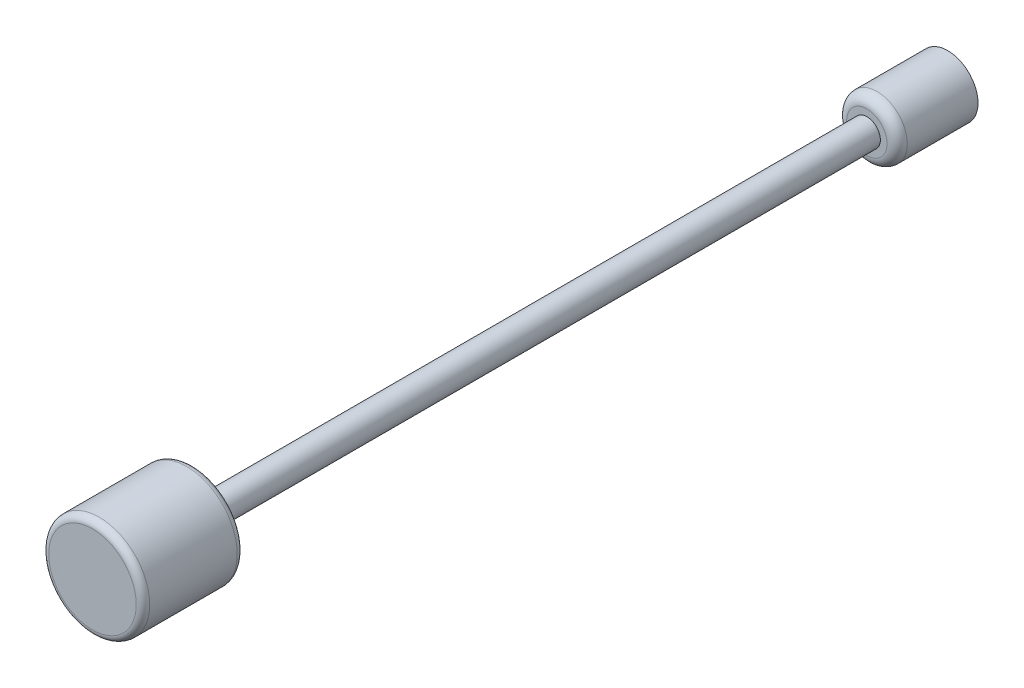
ISO-10303-21;
HEADER;
FILE_DESCRIPTION(('STEP AP214'),'2;1');
FILE_NAME('part.step','',(''),(''),'','','');
FILE_SCHEMA(('AUTOMOTIVE_DESIGN { 1 0 10303 214 1 1 1 1 }'));
ENDSEC;
DATA;
#1=APPLICATION_CONTEXT('core data for automotive mechanical design processes');
#2=APPLICATION_PROTOCOL_DEFINITION('international standard','automotive_design',2000,#1);
#3=PRODUCT_CONTEXT('',#1,'mechanical');
#4=PRODUCT('Part','Part','',(#3));
#5=PRODUCT_RELATED_PRODUCT_CATEGORY('part','',(#4));
#6=PRODUCT_DEFINITION_FORMATION('','',#4);
#7=PRODUCT_DEFINITION_CONTEXT('part definition',#1,'design');
#8=PRODUCT_DEFINITION('design','',#6,#7);
#9=PRODUCT_DEFINITION_SHAPE('','',#8);
#10=(LENGTH_UNIT() NAMED_UNIT(*) SI_UNIT(.MILLI.,.METRE.));
#11=(NAMED_UNIT(*) PLANE_ANGLE_UNIT() SI_UNIT($,.RADIAN.));
#12=(NAMED_UNIT(*) SI_UNIT($,.STERADIAN.) SOLID_ANGLE_UNIT());
#13=UNCERTAINTY_MEASURE_WITH_UNIT(LENGTH_MEASURE(1.E-05),#10,'distance_accuracy_value','');
#14=(GEOMETRIC_REPRESENTATION_CONTEXT(3) GLOBAL_UNCERTAINTY_ASSIGNED_CONTEXT((#13)) GLOBAL_UNIT_ASSIGNED_CONTEXT((#10,
#11,#12)) REPRESENTATION_CONTEXT('',''));
#15=CARTESIAN_POINT('',(0.,0.,0.));
#16=DIRECTION('',(0.,0.,1.));
#17=DIRECTION('',(1.,0.,0.));
#18=AXIS2_PLACEMENT_3D('',#15,#16,#17);
#19=CARTESIAN_POINT('',(1107.95071941482,105.911007761588,0.));
#20=DIRECTION('',(0.,0.,1.));
#21=DIRECTION('',(1.,0.,0.));
#22=AXIS2_PLACEMENT_3D('',#19,#20,#21);
#23=PLANE('',#22);
#24=CARTESIAN_POINT('',(1107.95071941482,105.911007761588,0.));
#25=DIRECTION('',(0.,0.,1.));
#26=DIRECTION('',(1.,0.,0.));
#27=AXIS2_PLACEMENT_3D('',#24,#25,#26);
#28=CIRCLE('',#27,4.50000000000002);
#29=CARTESIAN_POINT('',(1112.45071941482,105.911007761588,0.));
#30=VERTEX_POINT('',#29);
#31=EDGE_CURVE('E58',#30,#30,#28,.T.);
#32=ORIENTED_EDGE('',*,*,#31,.F.);
#33=EDGE_LOOP('',(#32));
#34=FACE_BOUND('',#33,.T.);
#35=CARTESIAN_POINT('',(1107.95071941482,105.911007761588,0.));
#36=DIRECTION('',(0.,0.,1.));
#37=DIRECTION('',(1.,0.,0.));
#38=AXIS2_PLACEMENT_3D('',#35,#36,#37);
#39=CIRCLE('',#38,3.00000000000016);
#40=CARTESIAN_POINT('',(1110.95071941482,105.911007761588,0.));
#41=VERTEX_POINT('',#40);
#42=EDGE_CURVE('E61',#41,#41,#39,.T.);
#43=ORIENTED_EDGE('',*,*,#42,.T.);
#44=EDGE_LOOP('',(#43));
#45=FACE_BOUND('',#44,.T.);
#46=ADVANCED_FACE('F31',(#34,#45),#23,.F.);
#47=CARTESIAN_POINT('',(1107.95071941482,105.911007761588,10.));
#48=DIRECTION('',(0.,0.,-1.));
#49=DIRECTION('',(-1.,0.,0.));
#50=AXIS2_PLACEMENT_3D('',#47,#48,#49);
#51=CYLINDRICAL_SURFACE('',#50,4.50000000000002);
#52=CARTESIAN_POINT('',(1107.95071941482,105.911007761588,10.5));
#53=DIRECTION('',(0.,0.,1.));
#54=DIRECTION('',(1.,0.,0.));
#55=AXIS2_PLACEMENT_3D('',#52,#53,#54);
#56=CIRCLE('',#55,4.50000000000002);
#57=CARTESIAN_POINT('',(1112.45071941482,105.911007761588,10.5));
#58=VERTEX_POINT('',#57);
#59=EDGE_CURVE('E10',#58,#58,#56,.F.);
#60=ORIENTED_EDGE('',*,*,#59,.T.);
#61=EDGE_LOOP('',(#60));
#62=FACE_BOUND('',#61,.T.);
#63=ORIENTED_EDGE('',*,*,#31,.T.);
#64=EDGE_LOOP('',(#63));
#65=FACE_BOUND('',#64,.T.);
#66=ADVANCED_FACE('F93',(#62,#65),#51,.T.);
#67=CARTESIAN_POINT('',(1107.95071941482,105.911007761588,10.));
#68=DIRECTION('',(0.,0.,-1.));
#69=DIRECTION('',(-1.,0.,0.));
#70=AXIS2_PLACEMENT_3D('',#67,#68,#69);
#71=CYLINDRICAL_SURFACE('',#70,3.00000000000016);
#72=CARTESIAN_POINT('',(1107.95071941482,105.911007761588,10.));
#73=DIRECTION('',(0.,0.,1.));
#74=DIRECTION('',(1.,0.,0.));
#75=AXIS2_PLACEMENT_3D('',#72,#73,#74);
#76=CIRCLE('',#75,3.00000000000016);
#77=CARTESIAN_POINT('',(1110.95071941482,105.911007761588,10.));
#78=VERTEX_POINT('',#77);
#79=EDGE_CURVE('E64',#78,#78,#76,.T.);
#80=ORIENTED_EDGE('',*,*,#79,.T.);
#81=EDGE_LOOP('',(#80));
#82=FACE_BOUND('',#81,.T.);
#83=ORIENTED_EDGE('',*,*,#42,.F.);
#84=EDGE_LOOP('',(#83));
#85=FACE_BOUND('',#84,.T.);
#86=ADVANCED_FACE('F89',(#82,#85),#71,.F.);
#87=CARTESIAN_POINT('',(1107.95071941482,105.911007761588,10.));
#88=DIRECTION('',(0.,0.,1.));
#89=DIRECTION('',(1.,0.,0.));
#90=AXIS2_PLACEMENT_3D('',#87,#88,#89);
#91=PLANE('',#90);
#92=ORIENTED_EDGE('',*,*,#79,.F.);
#93=EDGE_LOOP('',(#92));
#94=FACE_BOUND('',#93,.T.);
#95=ADVANCED_FACE('F84',(#94),#91,.F.);
#96=CARTESIAN_POINT('',(1107.95071941482,105.911007761588,12.));
#97=DIRECTION('',(0.,0.,1.));
#98=DIRECTION('',(1.,0.,0.));
#99=AXIS2_PLACEMENT_3D('',#96,#97,#98);
#100=PLANE('',#99);
#101=CARTESIAN_POINT('',(1107.95071941482,105.911007761588,12.));
#102=DIRECTION('',(0.,0.,1.));
#103=DIRECTION('',(1.,0.,0.));
#104=AXIS2_PLACEMENT_3D('',#101,#102,#103);
#105=CIRCLE('',#104,3.00000000000002);
#106=CARTESIAN_POINT('',(1110.95071941482,105.911007761588,12.));
#107=VERTEX_POINT('',#106);
#108=EDGE_CURVE('E38',#107,#107,#105,.T.);
#109=ORIENTED_EDGE('',*,*,#108,.T.);
#110=EDGE_LOOP('',(#109));
#111=FACE_BOUND('',#110,.T.);
#112=CARTESIAN_POINT('',(1107.95071941482,105.911007761588,12.));
#113=DIRECTION('',(0.,0.,1.));
#114=DIRECTION('',(1.,0.,0.));
#115=AXIS2_PLACEMENT_3D('',#112,#113,#114);
#116=CIRCLE('',#115,2.0000000000001);
#117=CARTESIAN_POINT('',(1109.95071941482,105.911007761588,12.));
#118=VERTEX_POINT('',#117);
#119=EDGE_CURVE('E57',#118,#118,#116,.T.);
#120=ORIENTED_EDGE('',*,*,#119,.F.);
#121=EDGE_LOOP('',(#120));
#122=FACE_BOUND('',#121,.T.);
#123=ADVANCED_FACE('F79',(#111,#122),#100,.T.);
#124=CARTESIAN_POINT('',(1107.95071941482,105.911007761588,112.));
#125=DIRECTION('',(0.,0.,-1.));
#126=DIRECTION('',(-1.,0.,0.));
#127=AXIS2_PLACEMENT_3D('',#124,#125,#126);
#128=CYLINDRICAL_SURFACE('',#127,2.0000000000001);
#129=CARTESIAN_POINT('',(1107.95071941482,105.911007761588,112.));
#130=DIRECTION('',(0.,0.,1.));
#131=DIRECTION('',(1.,0.,0.));
#132=AXIS2_PLACEMENT_3D('',#129,#130,#131);
#133=CIRCLE('',#132,2.0000000000001);
#134=CARTESIAN_POINT('',(1109.95071941482,105.911007761588,112.));
#135=VERTEX_POINT('',#134);
#136=EDGE_CURVE('E67',#135,#135,#133,.T.);
#137=ORIENTED_EDGE('',*,*,#136,.F.);
#138=EDGE_LOOP('',(#137));
#139=FACE_BOUND('',#138,.T.);
#140=ORIENTED_EDGE('',*,*,#119,.T.);
#141=EDGE_LOOP('',(#140));
#142=FACE_BOUND('',#141,.T.);
#143=ADVANCED_FACE('F75',(#139,#142),#128,.T.);
#144=CARTESIAN_POINT('',(1107.95071941482,105.911007761588,127.));
#145=DIRECTION('',(0.,0.,-1.));
#146=DIRECTION('',(-1.,0.,0.));
#147=AXIS2_PLACEMENT_3D('',#144,#145,#146);
#148=CYLINDRICAL_SURFACE('',#147,7.49999999999997);
#149=CARTESIAN_POINT('',(1107.95071941482,105.911007761588,113.));
#150=DIRECTION('',(0.,0.,1.));
#151=DIRECTION('',(1.,0.,0.));
#152=AXIS2_PLACEMENT_3D('',#149,#150,#151);
#153=CIRCLE('',#152,7.49999999999997);
#154=CARTESIAN_POINT('',(1115.45071941482,105.911007761588,113.));
#155=VERTEX_POINT('',#154);
#156=EDGE_CURVE('E51',#155,#155,#153,.T.);
#157=ORIENTED_EDGE('',*,*,#156,.T.);
#158=EDGE_LOOP('',(#157));
#159=FACE_BOUND('',#158,.T.);
#160=CARTESIAN_POINT('',(1107.95071941482,105.911007761588,126.));
#161=DIRECTION('',(0.,0.,1.));
#162=DIRECTION('',(1.,0.,0.));
#163=AXIS2_PLACEMENT_3D('',#160,#161,#162);
#164=CIRCLE('',#163,7.49999999999997);
#165=CARTESIAN_POINT('',(1115.45071941482,105.911007761588,126.));
#166=VERTEX_POINT('',#165);
#167=EDGE_CURVE('E54',#166,#166,#164,.F.);
#168=ORIENTED_EDGE('',*,*,#167,.T.);
#169=EDGE_LOOP('',(#168));
#170=FACE_BOUND('',#169,.T.);
#171=ADVANCED_FACE('F78',(#159,#170),#148,.T.);
#172=CARTESIAN_POINT('',(1107.95071941482,105.911007761588,127.));
#173=DIRECTION('',(0.,0.,1.));
#174=DIRECTION('',(1.,0.,0.));
#175=AXIS2_PLACEMENT_3D('',#172,#173,#174);
#176=PLANE('',#175);
#177=CARTESIAN_POINT('',(1107.95071941482,105.911007761588,127.));
#178=DIRECTION('',(0.,0.,1.));
#179=DIRECTION('',(1.,0.,0.));
#180=AXIS2_PLACEMENT_3D('',#177,#178,#179);
#181=CIRCLE('',#180,6.49999999999997);
#182=CARTESIAN_POINT('',(1114.45071941482,105.911007761588,127.));
#183=VERTEX_POINT('',#182);
#184=EDGE_CURVE('E42',#183,#183,#181,.T.);
#185=ORIENTED_EDGE('',*,*,#184,.T.);
#186=EDGE_LOOP('',(#185));
#187=FACE_BOUND('',#186,.T.);
#188=ADVANCED_FACE('F118',(#187),#176,.T.);
#189=CARTESIAN_POINT('',(1107.95071941482,105.911007761588,112.));
#190=DIRECTION('',(0.,0.,1.));
#191=DIRECTION('',(1.,0.,0.));
#192=AXIS2_PLACEMENT_3D('',#189,#190,#191);
#193=PLANE('',#192);
#194=CARTESIAN_POINT('',(1107.95071941482,105.911007761588,112.));
#195=DIRECTION('',(0.,0.,1.));
#196=DIRECTION('',(1.,0.,0.));
#197=AXIS2_PLACEMENT_3D('',#194,#195,#196);
#198=CIRCLE('',#197,6.49999999999997);
#199=CARTESIAN_POINT('',(1114.45071941482,105.911007761588,112.));
#200=VERTEX_POINT('',#199);
#201=EDGE_CURVE('E46',#200,#200,#198,.F.);
#202=ORIENTED_EDGE('',*,*,#201,.T.);
#203=EDGE_LOOP('',(#202));
#204=FACE_BOUND('',#203,.T.);
#205=ORIENTED_EDGE('',*,*,#136,.T.);
#206=EDGE_LOOP('',(#205));
#207=FACE_BOUND('',#206,.T.);
#208=ADVANCED_FACE('F73',(#204,#207),#193,.F.);
#209=CARTESIAN_POINT('',(1107.95071941482,105.911007761588,113.));
#210=DIRECTION('',(0.,0.,1.));
#211=DIRECTION('',(1.,0.,0.));
#212=AXIS2_PLACEMENT_3D('',#209,#210,#211);
#213=TOROIDAL_SURFACE('',#212,6.49999999999997,1.);
#214=ORIENTED_EDGE('',*,*,#201,.F.);
#215=EDGE_LOOP('',(#214));
#216=FACE_BOUND('',#215,.T.);
#217=ORIENTED_EDGE('',*,*,#156,.F.);
#218=EDGE_LOOP('',(#217));
#219=FACE_BOUND('',#218,.T.);
#220=ADVANCED_FACE('F104',(#216,#219),#213,.T.);
#221=CARTESIAN_POINT('',(1107.95071941482,105.911007761588,126.));
#222=DIRECTION('',(0.,0.,1.));
#223=DIRECTION('',(1.,0.,0.));
#224=AXIS2_PLACEMENT_3D('',#221,#222,#223);
#225=TOROIDAL_SURFACE('',#224,6.49999999999997,1.);
#226=ORIENTED_EDGE('',*,*,#167,.F.);
#227=EDGE_LOOP('',(#226));
#228=FACE_BOUND('',#227,.T.);
#229=ORIENTED_EDGE('',*,*,#184,.F.);
#230=EDGE_LOOP('',(#229));
#231=FACE_BOUND('',#230,.T.);
#232=ADVANCED_FACE('F106',(#228,#231),#225,.T.);
#233=CARTESIAN_POINT('',(1107.95071941482,105.911007761588,10.5));
#234=DIRECTION('',(0.,0.,1.));
#235=DIRECTION('',(1.,0.,0.));
#236=AXIS2_PLACEMENT_3D('',#233,#234,#235);
#237=TOROIDAL_SURFACE('',#236,3.00000000000002,1.5);
#238=ORIENTED_EDGE('',*,*,#59,.F.);
#239=EDGE_LOOP('',(#238));
#240=FACE_BOUND('',#239,.T.);
#241=ORIENTED_EDGE('',*,*,#108,.F.);
#242=EDGE_LOOP('',(#241));
#243=FACE_BOUND('',#242,.T.);
#244=ADVANCED_FACE('F33',(#240,#243),#237,.T.);
#245=CLOSED_SHELL('',(#46,#66,#86,#95,#123,#143,#171,#188,#208,#220,#232,#244));
#246=MANIFOLD_SOLID_BREP('B2',#245);
#247=ADVANCED_BREP_SHAPE_REPRESENTATION('',(#18,#246),#14);
#248=SHAPE_DEFINITION_REPRESENTATION(#9,#247);
ENDSEC;
END-ISO-10303-21;
